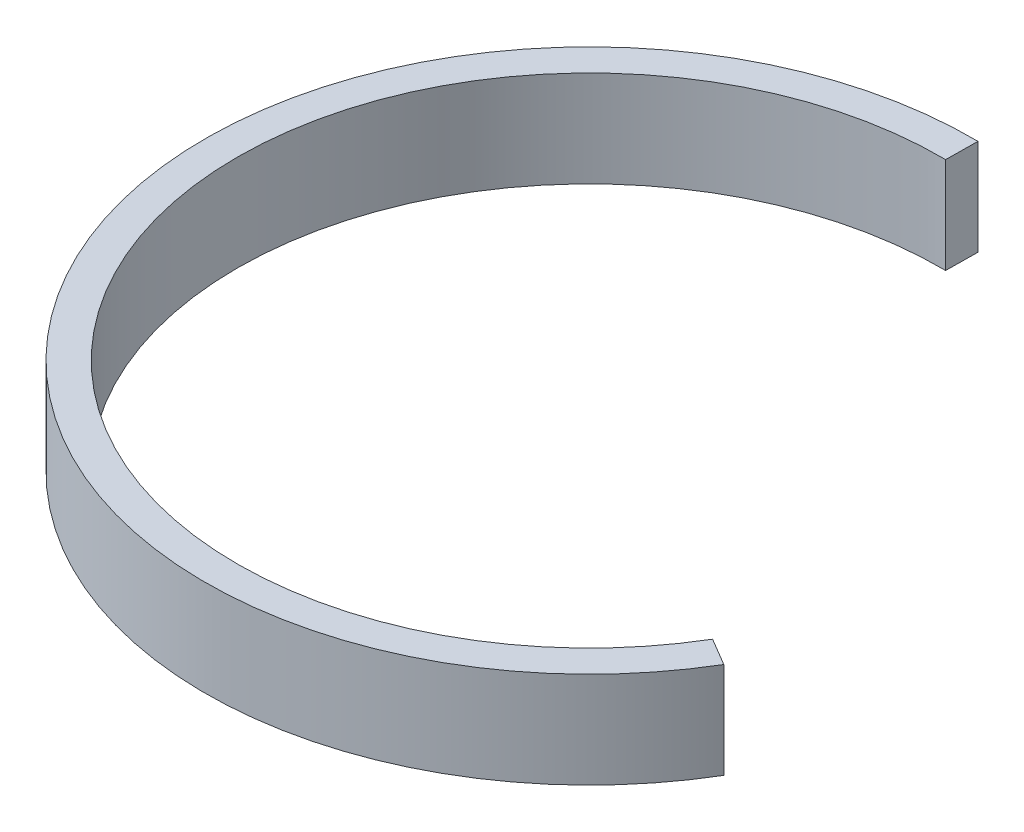
ISO-10303-21;
HEADER;
FILE_DESCRIPTION(('STEP AP214'),'2;1');
FILE_NAME('part.step','',(''),(''),'','','');
FILE_SCHEMA(('AUTOMOTIVE_DESIGN { 1 0 10303 214 1 1 1 1 }'));
ENDSEC;
DATA;
#1=APPLICATION_CONTEXT('core data for automotive mechanical design processes');
#2=APPLICATION_PROTOCOL_DEFINITION('international standard','automotive_design',2000,#1);
#3=PRODUCT_CONTEXT('',#1,'mechanical');
#4=PRODUCT('Part','Part','',(#3));
#5=PRODUCT_RELATED_PRODUCT_CATEGORY('part','',(#4));
#6=PRODUCT_DEFINITION_FORMATION('','',#4);
#7=PRODUCT_DEFINITION_CONTEXT('part definition',#1,'design');
#8=PRODUCT_DEFINITION('design','',#6,#7);
#9=PRODUCT_DEFINITION_SHAPE('','',#8);
#10=(LENGTH_UNIT() NAMED_UNIT(*) SI_UNIT(.MILLI.,.METRE.));
#11=(NAMED_UNIT(*) PLANE_ANGLE_UNIT() SI_UNIT($,.RADIAN.));
#12=(NAMED_UNIT(*) SI_UNIT($,.STERADIAN.) SOLID_ANGLE_UNIT());
#13=UNCERTAINTY_MEASURE_WITH_UNIT(LENGTH_MEASURE(1.E-05),#10,'distance_accuracy_value','');
#14=(GEOMETRIC_REPRESENTATION_CONTEXT(3) GLOBAL_UNCERTAINTY_ASSIGNED_CONTEXT((#13)) GLOBAL_UNIT_ASSIGNED_CONTEXT((#10,
#11,#12)) REPRESENTATION_CONTEXT('',''));
#15=CARTESIAN_POINT('',(0.,0.,0.));
#16=DIRECTION('',(0.,0.,1.));
#17=DIRECTION('',(1.,0.,0.));
#18=AXIS2_PLACEMENT_3D('',#15,#16,#17);
#19=CARTESIAN_POINT('',(0.,30.,0.));
#20=DIRECTION('',(0.,-1.,0.));
#21=DIRECTION('',(0.,0.,-1.));
#22=AXIS2_PLACEMENT_3D('',#19,#20,#21);
#23=CYLINDRICAL_SURFACE('',#22,110.);
#24=CARTESIAN_POINT('',(0.,0.,0.));
#25=DIRECTION('',(0.,-1.,0.));
#26=DIRECTION('',(0.,0.,1.));
#27=AXIS2_PLACEMENT_3D('',#24,#25,#26);
#28=CIRCLE('',#27,110.);
#29=CARTESIAN_POINT('',(94.6124816074705,0.,56.1113029974893));
#30=VERTEX_POINT('',#29);
#31=CARTESIAN_POINT('',(1.28757303153664,0.,-109.992464085902));
#32=VERTEX_POINT('',#31);
#33=EDGE_CURVE('E96',#30,#32,#28,.T.);
#34=ORIENTED_EDGE('',*,*,#33,.T.);
#35=DIRECTION('',(0.,-1.,0.));
#36=VECTOR('',#35,1.);
#37=CARTESIAN_POINT('',(1.28757303153664,30.,-109.992464085902));
#38=LINE('',#37,#36);
#39=CARTESIAN_POINT('',(1.28757303153664,30.,-109.992464085902));
#40=VERTEX_POINT('',#39);
#41=EDGE_CURVE('E11',#40,#32,#38,.T.);
#42=ORIENTED_EDGE('',*,*,#41,.F.);
#43=CARTESIAN_POINT('',(0.,30.,0.));
#44=DIRECTION('',(0.,-1.,0.));
#45=DIRECTION('',(0.,0.,1.));
#46=AXIS2_PLACEMENT_3D('',#43,#44,#45);
#47=CIRCLE('',#46,110.);
#48=CARTESIAN_POINT('',(94.6124816074705,30.,56.1113029974893));
#49=VERTEX_POINT('',#48);
#50=EDGE_CURVE('E84',#49,#40,#47,.T.);
#51=ORIENTED_EDGE('',*,*,#50,.F.);
#52=DIRECTION('',(0.,-1.,0.));
#53=VECTOR('',#52,1.);
#54=CARTESIAN_POINT('',(94.6124816074705,30.,56.1113029974893));
#55=LINE('',#54,#53);
#56=EDGE_CURVE('E92',#49,#30,#55,.T.);
#57=ORIENTED_EDGE('',*,*,#56,.T.);
#58=EDGE_LOOP('',(#34,#42,#51,#57));
#59=FACE_BOUND('',#58,.T.);
#60=ADVANCED_FACE('F33',(#59),#23,.F.);
#61=CARTESIAN_POINT('',(1.28757303153664,30.,-109.992464085902));
#62=DIRECTION('',(-0.999931491690019,0.,-0.0117052093776059));
#63=DIRECTION('',(-0.0117052093776059,0.,0.999931491690019));
#64=AXIS2_PLACEMENT_3D('',#61,#62,#63);
#65=PLANE('',#64);
#66=DIRECTION('',(0.0117052093776059,0.,-0.999931491690019));
#67=VECTOR('',#66,1.);
#68=CARTESIAN_POINT('',(1.28757303153664,0.,-109.992464085902));
#69=LINE('',#68,#67);
#70=CARTESIAN_POINT('',(1.4046251253127,0.,-119.991779002802));
#71=VERTEX_POINT('',#70);
#72=EDGE_CURVE('E88',#32,#71,#69,.T.);
#73=ORIENTED_EDGE('',*,*,#72,.T.);
#74=DIRECTION('',(0.,-1.,0.));
#75=VECTOR('',#74,1.);
#76=CARTESIAN_POINT('',(1.4046251253127,30.,-119.991779002802));
#77=LINE('',#76,#75);
#78=CARTESIAN_POINT('',(1.4046251253127,30.,-119.991779002802));
#79=VERTEX_POINT('',#78);
#80=EDGE_CURVE('E41',#79,#71,#77,.T.);
#81=ORIENTED_EDGE('',*,*,#80,.F.);
#82=DIRECTION('',(0.0117052093776059,0.,-0.999931491690019));
#83=VECTOR('',#82,1.);
#84=CARTESIAN_POINT('',(1.28757303153664,30.,-109.992464085902));
#85=LINE('',#84,#83);
#86=EDGE_CURVE('E79',#40,#79,#85,.T.);
#87=ORIENTED_EDGE('',*,*,#86,.F.);
#88=ORIENTED_EDGE('',*,*,#41,.T.);
#89=EDGE_LOOP('',(#73,#81,#87,#88));
#90=FACE_BOUND('',#89,.T.);
#91=ADVANCED_FACE('F87',(#90),#65,.F.);
#92=CARTESIAN_POINT('',(0.,30.,0.));
#93=DIRECTION('',(0.,-1.,0.));
#94=DIRECTION('',(0.,0.,-1.));
#95=AXIS2_PLACEMENT_3D('',#92,#93,#94);
#96=CYLINDRICAL_SURFACE('',#95,120.);
#97=CARTESIAN_POINT('',(0.,0.,0.));
#98=DIRECTION('',(0.,1.,0.));
#99=DIRECTION('',(0.,0.,1.));
#100=AXIS2_PLACEMENT_3D('',#97,#98,#99);
#101=CIRCLE('',#100,120.);
#102=CARTESIAN_POINT('',(103.213616299059,0.,61.2123305427156));
#103=VERTEX_POINT('',#102);
#104=EDGE_CURVE('E66',#71,#103,#101,.T.);
#105=ORIENTED_EDGE('',*,*,#104,.T.);
#106=DIRECTION('',(0.,-1.,0.));
#107=VECTOR('',#106,1.);
#108=CARTESIAN_POINT('',(103.213616299059,30.,61.2123305427156));
#109=LINE('',#108,#107);
#110=CARTESIAN_POINT('',(103.213616299059,30.,61.2123305427156));
#111=VERTEX_POINT('',#110);
#112=EDGE_CURVE('E89',#111,#103,#109,.T.);
#113=ORIENTED_EDGE('',*,*,#112,.F.);
#114=CARTESIAN_POINT('',(0.,30.,0.));
#115=DIRECTION('',(0.,1.,0.));
#116=DIRECTION('',(0.,0.,1.));
#117=AXIS2_PLACEMENT_3D('',#114,#115,#116);
#118=CIRCLE('',#117,120.);
#119=EDGE_CURVE('E82',#79,#111,#118,.T.);
#120=ORIENTED_EDGE('',*,*,#119,.F.);
#121=ORIENTED_EDGE('',*,*,#80,.T.);
#122=EDGE_LOOP('',(#105,#113,#120,#121));
#123=FACE_BOUND('',#122,.T.);
#124=ADVANCED_FACE('F90',(#123),#96,.T.);
#125=CARTESIAN_POINT('',(103.213616299059,30.,61.2123305427156));
#126=DIRECTION('',(-0.51010275452263,0.,0.860113469158823));
#127=DIRECTION('',(0.860113469158823,0.,0.51010275452263));
#128=AXIS2_PLACEMENT_3D('',#125,#126,#127);
#129=PLANE('',#128);
#130=DIRECTION('',(-0.860113469158823,0.,-0.51010275452263));
#131=VECTOR('',#130,1.);
#132=CARTESIAN_POINT('',(103.213616299059,0.,61.2123305427156));
#133=LINE('',#132,#131);
#134=EDGE_CURVE('E72',#103,#30,#133,.T.);
#135=ORIENTED_EDGE('',*,*,#134,.T.);
#136=ORIENTED_EDGE('',*,*,#56,.F.);
#137=DIRECTION('',(-0.860113469158823,0.,-0.51010275452263));
#138=VECTOR('',#137,1.);
#139=CARTESIAN_POINT('',(103.213616299059,30.,61.2123305427156));
#140=LINE('',#139,#138);
#141=EDGE_CURVE('E49',#111,#49,#140,.T.);
#142=ORIENTED_EDGE('',*,*,#141,.F.);
#143=ORIENTED_EDGE('',*,*,#112,.T.);
#144=EDGE_LOOP('',(#135,#136,#142,#143));
#145=FACE_BOUND('',#144,.T.);
#146=ADVANCED_FACE('F103',(#145),#129,.F.);
#147=CARTESIAN_POINT('',(0.,30.,0.));
#148=DIRECTION('',(0.,1.,0.));
#149=DIRECTION('',(0.,0.,1.));
#150=AXIS2_PLACEMENT_3D('',#147,#148,#149);
#151=PLANE('',#150);
#152=ORIENTED_EDGE('',*,*,#50,.T.);
#153=ORIENTED_EDGE('',*,*,#86,.T.);
#154=ORIENTED_EDGE('',*,*,#119,.T.);
#155=ORIENTED_EDGE('',*,*,#141,.T.);
#156=EDGE_LOOP('',(#152,#153,#154,#155));
#157=FACE_BOUND('',#156,.T.);
#158=ADVANCED_FACE('F80',(#157),#151,.T.);
#159=CARTESIAN_POINT('',(0.,0.,0.));
#160=DIRECTION('',(0.,1.,0.));
#161=DIRECTION('',(0.,0.,1.));
#162=AXIS2_PLACEMENT_3D('',#159,#160,#161);
#163=PLANE('',#162);
#164=ORIENTED_EDGE('',*,*,#33,.F.);
#165=ORIENTED_EDGE('',*,*,#134,.F.);
#166=ORIENTED_EDGE('',*,*,#104,.F.);
#167=ORIENTED_EDGE('',*,*,#72,.F.);
#168=EDGE_LOOP('',(#164,#165,#166,#167));
#169=FACE_BOUND('',#168,.T.);
#170=ADVANCED_FACE('F106',(#169),#163,.F.);
#171=CLOSED_SHELL('',(#60,#91,#124,#146,#158,#170));
#172=MANIFOLD_SOLID_BREP('B2',#171);
#173=ADVANCED_BREP_SHAPE_REPRESENTATION('',(#18,#172),#14);
#174=SHAPE_DEFINITION_REPRESENTATION(#9,#173);
ENDSEC;
END-ISO-10303-21;
